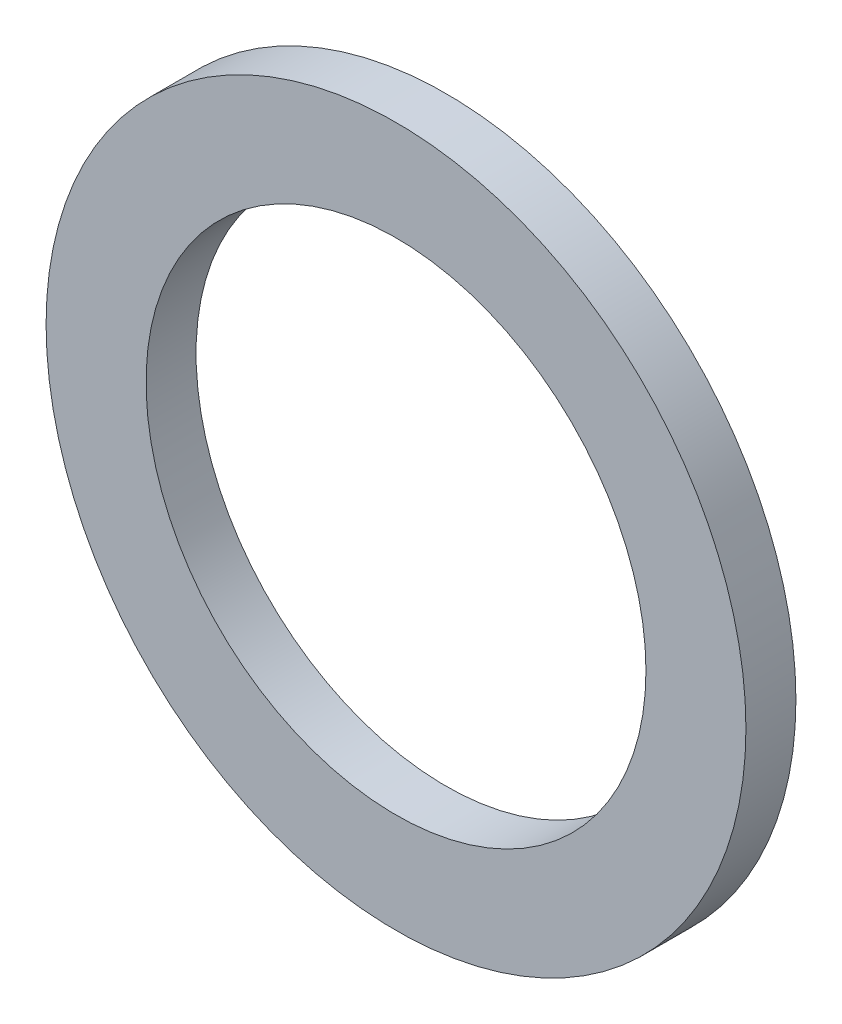
ISO-10303-21;
HEADER;
FILE_DESCRIPTION(('STEP AP214'),'2;1');
FILE_NAME('part.step','',(''),(''),'','','');
FILE_SCHEMA(('AUTOMOTIVE_DESIGN { 1 0 10303 214 1 1 1 1 }'));
ENDSEC;
DATA;
#1=APPLICATION_CONTEXT('core data for automotive mechanical design processes');
#2=APPLICATION_PROTOCOL_DEFINITION('international standard','automotive_design',2000,#1);
#3=PRODUCT_CONTEXT('',#1,'mechanical');
#4=PRODUCT('Part','Part','',(#3));
#5=PRODUCT_RELATED_PRODUCT_CATEGORY('part','',(#4));
#6=PRODUCT_DEFINITION_FORMATION('','',#4);
#7=PRODUCT_DEFINITION_CONTEXT('part definition',#1,'design');
#8=PRODUCT_DEFINITION('design','',#6,#7);
#9=PRODUCT_DEFINITION_SHAPE('','',#8);
#10=(LENGTH_UNIT() NAMED_UNIT(*) SI_UNIT(.MILLI.,.METRE.));
#11=(NAMED_UNIT(*) PLANE_ANGLE_UNIT() SI_UNIT($,.RADIAN.));
#12=(NAMED_UNIT(*) SI_UNIT($,.STERADIAN.) SOLID_ANGLE_UNIT());
#13=UNCERTAINTY_MEASURE_WITH_UNIT(LENGTH_MEASURE(1.E-05),#10,'distance_accuracy_value','');
#14=(GEOMETRIC_REPRESENTATION_CONTEXT(3) GLOBAL_UNCERTAINTY_ASSIGNED_CONTEXT((#13)) GLOBAL_UNIT_ASSIGNED_CONTEXT((#10,
#11,#12)) REPRESENTATION_CONTEXT('',''));
#15=CARTESIAN_POINT('',(0.,0.,0.));
#16=DIRECTION('',(0.,0.,1.));
#17=DIRECTION('',(1.,0.,0.));
#18=AXIS2_PLACEMENT_3D('',#15,#16,#17);
#19=CARTESIAN_POINT('',(0.,0.,0.5));
#20=DIRECTION('',(0.,0.,1.));
#21=DIRECTION('',(1.,0.,0.));
#22=AXIS2_PLACEMENT_3D('',#19,#20,#21);
#23=PLANE('',#22);
#24=CARTESIAN_POINT('',(0.,0.,0.5));
#25=DIRECTION('',(0.,0.,1.));
#26=DIRECTION('',(1.,0.,0.));
#27=AXIS2_PLACEMENT_3D('',#24,#25,#26);
#28=CIRCLE('',#27,3.5);
#29=CARTESIAN_POINT('',(3.5,0.,0.5));
#30=VERTEX_POINT('',#29);
#31=EDGE_CURVE('E10',#30,#30,#28,.T.);
#32=ORIENTED_EDGE('',*,*,#31,.T.);
#33=EDGE_LOOP('',(#32));
#34=FACE_BOUND('',#33,.T.);
#35=CARTESIAN_POINT('',(0.,0.,0.5));
#36=DIRECTION('',(0.,0.,1.));
#37=DIRECTION('',(1.,0.,0.));
#38=AXIS2_PLACEMENT_3D('',#35,#36,#37);
#39=CIRCLE('',#38,2.5);
#40=CARTESIAN_POINT('',(2.5,0.,0.5));
#41=VERTEX_POINT('',#40);
#42=EDGE_CURVE('E45',#41,#41,#39,.T.);
#43=ORIENTED_EDGE('',*,*,#42,.F.);
#44=EDGE_LOOP('',(#43));
#45=FACE_BOUND('',#44,.T.);
#46=ADVANCED_FACE('F34',(#34,#45),#23,.T.);
#47=CARTESIAN_POINT('',(0.,0.,0.));
#48=DIRECTION('',(0.,0.,1.));
#49=DIRECTION('',(1.,0.,0.));
#50=AXIS2_PLACEMENT_3D('',#47,#48,#49);
#51=PLANE('',#50);
#52=CARTESIAN_POINT('',(0.,0.,0.));
#53=DIRECTION('',(0.,0.,1.));
#54=DIRECTION('',(1.,0.,0.));
#55=AXIS2_PLACEMENT_3D('',#52,#53,#54);
#56=CIRCLE('',#55,3.5);
#57=CARTESIAN_POINT('',(3.5,0.,0.));
#58=VERTEX_POINT('',#57);
#59=EDGE_CURVE('E38',#58,#58,#56,.T.);
#60=ORIENTED_EDGE('',*,*,#59,.F.);
#61=EDGE_LOOP('',(#60));
#62=FACE_BOUND('',#61,.T.);
#63=CARTESIAN_POINT('',(0.,0.,0.));
#64=DIRECTION('',(0.,0.,1.));
#65=DIRECTION('',(1.,0.,0.));
#66=AXIS2_PLACEMENT_3D('',#63,#64,#65);
#67=CIRCLE('',#66,2.5);
#68=CARTESIAN_POINT('',(2.5,0.,0.));
#69=VERTEX_POINT('',#68);
#70=EDGE_CURVE('E47',#69,#69,#67,.T.);
#71=ORIENTED_EDGE('',*,*,#70,.T.);
#72=EDGE_LOOP('',(#71));
#73=FACE_BOUND('',#72,.T.);
#74=ADVANCED_FACE('F57',(#62,#73),#51,.F.);
#75=CARTESIAN_POINT('',(0.,0.,0.5));
#76=DIRECTION('',(0.,0.,-1.));
#77=DIRECTION('',(-1.,0.,0.));
#78=AXIS2_PLACEMENT_3D('',#75,#76,#77);
#79=CYLINDRICAL_SURFACE('',#78,3.5);
#80=ORIENTED_EDGE('',*,*,#31,.F.);
#81=EDGE_LOOP('',(#80));
#82=FACE_BOUND('',#81,.T.);
#83=ORIENTED_EDGE('',*,*,#59,.T.);
#84=EDGE_LOOP('',(#83));
#85=FACE_BOUND('',#84,.T.);
#86=ADVANCED_FACE('F36',(#82,#85),#79,.T.);
#87=CARTESIAN_POINT('',(0.,0.,0.5));
#88=DIRECTION('',(0.,0.,-1.));
#89=DIRECTION('',(-1.,0.,0.));
#90=AXIS2_PLACEMENT_3D('',#87,#88,#89);
#91=CYLINDRICAL_SURFACE('',#90,2.5);
#92=ORIENTED_EDGE('',*,*,#42,.T.);
#93=EDGE_LOOP('',(#92));
#94=FACE_BOUND('',#93,.T.);
#95=ORIENTED_EDGE('',*,*,#70,.F.);
#96=EDGE_LOOP('',(#95));
#97=FACE_BOUND('',#96,.T.);
#98=ADVANCED_FACE('F53',(#94,#97),#91,.F.);
#99=CLOSED_SHELL('',(#46,#74,#86,#98));
#100=MANIFOLD_SOLID_BREP('B2',#99);
#101=ADVANCED_BREP_SHAPE_REPRESENTATION('',(#18,#100),#14);
#102=SHAPE_DEFINITION_REPRESENTATION(#9,#101);
ENDSEC;
END-ISO-10303-21;
